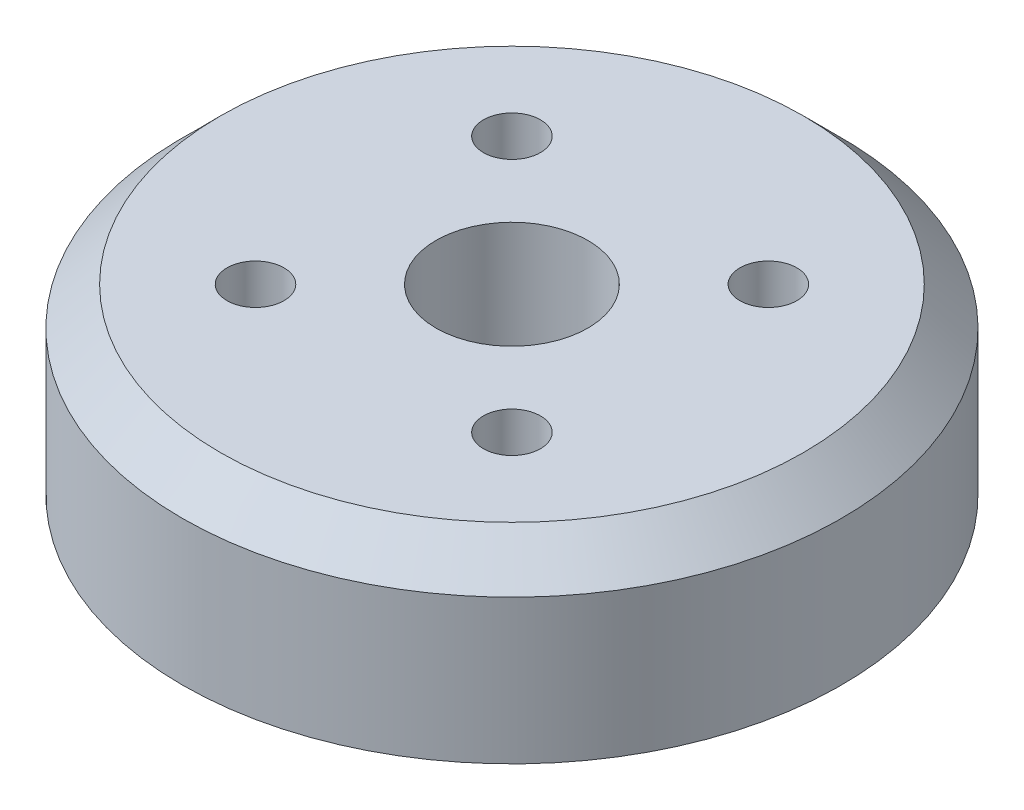
ISO-10303-21;
HEADER;
FILE_DESCRIPTION(('STEP AP214'),'2;1');
FILE_NAME('part.step','',(''),(''),'','','');
FILE_SCHEMA(('AUTOMOTIVE_DESIGN { 1 0 10303 214 1 1 1 1 }'));
ENDSEC;
DATA;
#1=APPLICATION_CONTEXT('core data for automotive mechanical design processes');
#2=APPLICATION_PROTOCOL_DEFINITION('international standard','automotive_design',2000,#1);
#3=PRODUCT_CONTEXT('',#1,'mechanical');
#4=PRODUCT('Part','Part','',(#3));
#5=PRODUCT_RELATED_PRODUCT_CATEGORY('part','',(#4));
#6=PRODUCT_DEFINITION_FORMATION('','',#4);
#7=PRODUCT_DEFINITION_CONTEXT('part definition',#1,'design');
#8=PRODUCT_DEFINITION('design','',#6,#7);
#9=PRODUCT_DEFINITION_SHAPE('','',#8);
#10=(LENGTH_UNIT() NAMED_UNIT(*) SI_UNIT(.MILLI.,.METRE.));
#11=(NAMED_UNIT(*) PLANE_ANGLE_UNIT() SI_UNIT($,.RADIAN.));
#12=(NAMED_UNIT(*) SI_UNIT($,.STERADIAN.) SOLID_ANGLE_UNIT());
#13=UNCERTAINTY_MEASURE_WITH_UNIT(LENGTH_MEASURE(1.E-05),#10,'distance_accuracy_value','');
#14=(GEOMETRIC_REPRESENTATION_CONTEXT(3) GLOBAL_UNCERTAINTY_ASSIGNED_CONTEXT((#13)) GLOBAL_UNIT_ASSIGNED_CONTEXT((#10,
#11,#12)) REPRESENTATION_CONTEXT('',''));
#15=CARTESIAN_POINT('',(0.,0.,0.));
#16=DIRECTION('',(0.,0.,1.));
#17=DIRECTION('',(1.,0.,0.));
#18=AXIS2_PLACEMENT_3D('',#15,#16,#17);
#19=CARTESIAN_POINT('',(0.,9.6,0.));
#20=DIRECTION('',(0.,-1.,0.));
#21=DIRECTION('',(0.,0.,-1.));
#22=AXIS2_PLACEMENT_3D('',#19,#20,#21);
#23=CYLINDRICAL_SURFACE('',#22,17.35);
#24=CARTESIAN_POINT('',(0.,7.6,0.));
#25=DIRECTION('',(0.,1.,0.));
#26=DIRECTION('',(0.,0.,1.));
#27=AXIS2_PLACEMENT_3D('',#24,#25,#26);
#28=CIRCLE('',#27,17.35);
#29=CARTESIAN_POINT('',(0.,7.6,17.35));
#30=VERTEX_POINT('',#29);
#31=EDGE_CURVE('E10',#30,#30,#28,.F.);
#32=ORIENTED_EDGE('',*,*,#31,.T.);
#33=EDGE_LOOP('',(#32));
#34=FACE_BOUND('',#33,.T.);
#35=CARTESIAN_POINT('',(0.,0.,0.));
#36=DIRECTION('',(0.,1.,0.));
#37=DIRECTION('',(0.,0.,1.));
#38=AXIS2_PLACEMENT_3D('',#35,#36,#37);
#39=CIRCLE('',#38,17.35);
#40=CARTESIAN_POINT('',(0.,0.,17.35));
#41=VERTEX_POINT('',#40);
#42=EDGE_CURVE('E48',#41,#41,#39,.T.);
#43=ORIENTED_EDGE('',*,*,#42,.T.);
#44=EDGE_LOOP('',(#43));
#45=FACE_BOUND('',#44,.T.);
#46=ADVANCED_FACE('F36',(#34,#45),#23,.T.);
#47=CARTESIAN_POINT('',(0.,9.6,0.));
#48=DIRECTION('',(0.,1.,0.));
#49=DIRECTION('',(0.,0.,1.));
#50=AXIS2_PLACEMENT_3D('',#47,#48,#49);
#51=PLANE('',#50);
#52=CARTESIAN_POINT('',(0.,9.6,0.));
#53=DIRECTION('',(0.,1.,0.));
#54=DIRECTION('',(0.,0.,1.));
#55=AXIS2_PLACEMENT_3D('',#52,#53,#54);
#56=CIRCLE('',#55,4.);
#57=CARTESIAN_POINT('',(0.,9.6,4.));
#58=VERTEX_POINT('',#57);
#59=EDGE_CURVE('E64',#58,#58,#56,.T.);
#60=ORIENTED_EDGE('',*,*,#59,.F.);
#61=EDGE_LOOP('',(#60));
#62=FACE_BOUND('',#61,.T.);
#63=CARTESIAN_POINT('',(-6.74999999999981,9.6,6.75));
#64=DIRECTION('',(0.,1.,0.));
#65=DIRECTION('',(0.,0.,1.));
#66=AXIS2_PLACEMENT_3D('',#63,#64,#65);
#67=CIRCLE('',#66,1.50000000000015);
#68=CARTESIAN_POINT('',(-6.74999999999981,9.6,8.25000000000015));
#69=VERTEX_POINT('',#68);
#70=EDGE_CURVE('E70',#69,#69,#67,.T.);
#71=ORIENTED_EDGE('',*,*,#70,.F.);
#72=EDGE_LOOP('',(#71));
#73=FACE_BOUND('',#72,.T.);
#74=CARTESIAN_POINT('',(6.75000000000019,9.6,6.74999999999981));
#75=DIRECTION('',(0.,1.,0.));
#76=DIRECTION('',(0.,0.,1.));
#77=AXIS2_PLACEMENT_3D('',#74,#75,#76);
#78=CIRCLE('',#77,1.5000000000003);
#79=CARTESIAN_POINT('',(6.75000000000019,9.6,8.25000000000011));
#80=VERTEX_POINT('',#79);
#81=EDGE_CURVE('E76',#80,#80,#78,.T.);
#82=ORIENTED_EDGE('',*,*,#81,.F.);
#83=EDGE_LOOP('',(#82));
#84=FACE_BOUND('',#83,.T.);
#85=CARTESIAN_POINT('',(6.75,9.6,-6.75000000000019));
#86=DIRECTION('',(0.,1.,0.));
#87=DIRECTION('',(0.,0.,1.));
#88=AXIS2_PLACEMENT_3D('',#85,#86,#87);
#89=CIRCLE('',#88,1.50000000000021);
#90=CARTESIAN_POINT('',(6.75,9.6,-5.24999999999998));
#91=VERTEX_POINT('',#90);
#92=EDGE_CURVE('E58',#91,#91,#89,.T.);
#93=ORIENTED_EDGE('',*,*,#92,.F.);
#94=EDGE_LOOP('',(#93));
#95=FACE_BOUND('',#94,.T.);
#96=CARTESIAN_POINT('',(-6.75,9.6,-6.75));
#97=DIRECTION('',(0.,1.,0.));
#98=DIRECTION('',(0.,0.,1.));
#99=AXIS2_PLACEMENT_3D('',#96,#97,#98);
#100=CIRCLE('',#99,1.5);
#101=CARTESIAN_POINT('',(-6.75,9.6,-5.25));
#102=VERTEX_POINT('',#101);
#103=EDGE_CURVE('E55',#102,#102,#100,.T.);
#104=ORIENTED_EDGE('',*,*,#103,.F.);
#105=EDGE_LOOP('',(#104));
#106=FACE_BOUND('',#105,.T.);
#107=CARTESIAN_POINT('',(0.,9.6,0.));
#108=DIRECTION('',(0.,1.,0.));
#109=DIRECTION('',(0.,0.,1.));
#110=AXIS2_PLACEMENT_3D('',#107,#108,#109);
#111=CIRCLE('',#110,15.35);
#112=CARTESIAN_POINT('',(0.,9.6,15.35));
#113=VERTEX_POINT('',#112);
#114=EDGE_CURVE('E44',#113,#113,#111,.T.);
#115=ORIENTED_EDGE('',*,*,#114,.T.);
#116=EDGE_LOOP('',(#115));
#117=FACE_BOUND('',#116,.T.);
#118=ADVANCED_FACE('F87',(#62,#73,#84,#95,#106,#117),#51,.T.);
#119=CARTESIAN_POINT('',(0.,0.,0.));
#120=DIRECTION('',(0.,1.,0.));
#121=DIRECTION('',(0.,0.,1.));
#122=AXIS2_PLACEMENT_3D('',#119,#120,#121);
#123=PLANE('',#122);
#124=CARTESIAN_POINT('',(0.,0.,0.));
#125=DIRECTION('',(0.,1.,0.));
#126=DIRECTION('',(0.,0.,1.));
#127=AXIS2_PLACEMENT_3D('',#124,#125,#126);
#128=CIRCLE('',#127,4.);
#129=CARTESIAN_POINT('',(0.,0.,4.));
#130=VERTEX_POINT('',#129);
#131=EDGE_CURVE('E61',#130,#130,#128,.T.);
#132=ORIENTED_EDGE('',*,*,#131,.T.);
#133=EDGE_LOOP('',(#132));
#134=FACE_BOUND('',#133,.T.);
#135=CARTESIAN_POINT('',(-6.74999999999981,0.,6.75));
#136=DIRECTION('',(0.,1.,0.));
#137=DIRECTION('',(0.,0.,1.));
#138=AXIS2_PLACEMENT_3D('',#135,#136,#137);
#139=CIRCLE('',#138,1.50000000000015);
#140=CARTESIAN_POINT('',(-6.74999999999981,0.,8.25000000000015));
#141=VERTEX_POINT('',#140);
#142=EDGE_CURVE('E67',#141,#141,#139,.T.);
#143=ORIENTED_EDGE('',*,*,#142,.T.);
#144=EDGE_LOOP('',(#143));
#145=FACE_BOUND('',#144,.T.);
#146=CARTESIAN_POINT('',(6.75000000000019,0.,6.74999999999981));
#147=DIRECTION('',(0.,1.,0.));
#148=DIRECTION('',(0.,0.,1.));
#149=AXIS2_PLACEMENT_3D('',#146,#147,#148);
#150=CIRCLE('',#149,1.5000000000003);
#151=CARTESIAN_POINT('',(6.75000000000019,0.,8.25000000000011));
#152=VERTEX_POINT('',#151);
#153=EDGE_CURVE('E73',#152,#152,#150,.T.);
#154=ORIENTED_EDGE('',*,*,#153,.T.);
#155=EDGE_LOOP('',(#154));
#156=FACE_BOUND('',#155,.T.);
#157=CARTESIAN_POINT('',(6.75,0.,-6.75000000000019));
#158=DIRECTION('',(0.,1.,0.));
#159=DIRECTION('',(0.,0.,1.));
#160=AXIS2_PLACEMENT_3D('',#157,#158,#159);
#161=CIRCLE('',#160,1.50000000000021);
#162=CARTESIAN_POINT('',(6.75,0.,-5.24999999999998));
#163=VERTEX_POINT('',#162);
#164=EDGE_CURVE('E79',#163,#163,#161,.T.);
#165=ORIENTED_EDGE('',*,*,#164,.T.);
#166=EDGE_LOOP('',(#165));
#167=FACE_BOUND('',#166,.T.);
#168=CARTESIAN_POINT('',(-6.75,0.,-6.75));
#169=DIRECTION('',(0.,1.,0.));
#170=DIRECTION('',(0.,0.,1.));
#171=AXIS2_PLACEMENT_3D('',#168,#169,#170);
#172=CIRCLE('',#171,1.5);
#173=CARTESIAN_POINT('',(-6.75,0.,-5.25));
#174=VERTEX_POINT('',#173);
#175=EDGE_CURVE('E52',#174,#174,#172,.T.);
#176=ORIENTED_EDGE('',*,*,#175,.T.);
#177=EDGE_LOOP('',(#176));
#178=FACE_BOUND('',#177,.T.);
#179=ORIENTED_EDGE('',*,*,#42,.F.);
#180=EDGE_LOOP('',(#179));
#181=FACE_BOUND('',#180,.T.);
#182=ADVANCED_FACE('F90',(#134,#145,#156,#167,#178,#181),#123,.F.);
#183=CARTESIAN_POINT('',(0.,9.6,0.));
#184=DIRECTION('',(0.,-1.,0.));
#185=DIRECTION('',(0.,0.,-1.));
#186=AXIS2_PLACEMENT_3D('',#183,#184,#185);
#187=CONICAL_SURFACE('',#186,15.35,0.785398163397446);
#188=ORIENTED_EDGE('',*,*,#31,.F.);
#189=EDGE_LOOP('',(#188));
#190=FACE_BOUND('',#189,.T.);
#191=ORIENTED_EDGE('',*,*,#114,.F.);
#192=EDGE_LOOP('',(#191));
#193=FACE_BOUND('',#192,.T.);
#194=ADVANCED_FACE('F39',(#190,#193),#187,.T.);
#195=CARTESIAN_POINT('',(-6.75,0.,-6.75));
#196=DIRECTION('',(0.,1.,0.));
#197=DIRECTION('',(0.,0.,1.));
#198=AXIS2_PLACEMENT_3D('',#195,#196,#197);
#199=CYLINDRICAL_SURFACE('',#198,1.5);
#200=ORIENTED_EDGE('',*,*,#175,.F.);
#201=EDGE_LOOP('',(#200));
#202=FACE_BOUND('',#201,.T.);
#203=ORIENTED_EDGE('',*,*,#103,.T.);
#204=EDGE_LOOP('',(#203));
#205=FACE_BOUND('',#204,.T.);
#206=ADVANCED_FACE('F95',(#202,#205),#199,.F.);
#207=CARTESIAN_POINT('',(6.75,0.,-6.75000000000019));
#208=DIRECTION('',(0.,1.,0.));
#209=DIRECTION('',(0.,0.,1.));
#210=AXIS2_PLACEMENT_3D('',#207,#208,#209);
#211=CYLINDRICAL_SURFACE('',#210,1.50000000000021);
#212=ORIENTED_EDGE('',*,*,#164,.F.);
#213=EDGE_LOOP('',(#212));
#214=FACE_BOUND('',#213,.T.);
#215=ORIENTED_EDGE('',*,*,#92,.T.);
#216=EDGE_LOOP('',(#215));
#217=FACE_BOUND('',#216,.T.);
#218=ADVANCED_FACE('F85',(#214,#217),#211,.F.);
#219=CARTESIAN_POINT('',(6.75000000000019,0.,6.74999999999981));
#220=DIRECTION('',(0.,1.,0.));
#221=DIRECTION('',(0.,0.,1.));
#222=AXIS2_PLACEMENT_3D('',#219,#220,#221);
#223=CYLINDRICAL_SURFACE('',#222,1.5000000000003);
#224=ORIENTED_EDGE('',*,*,#153,.F.);
#225=EDGE_LOOP('',(#224));
#226=FACE_BOUND('',#225,.T.);
#227=ORIENTED_EDGE('',*,*,#81,.T.);
#228=EDGE_LOOP('',(#227));
#229=FACE_BOUND('',#228,.T.);
#230=ADVANCED_FACE('F103',(#226,#229),#223,.F.);
#231=CARTESIAN_POINT('',(-6.74999999999981,0.,6.75));
#232=DIRECTION('',(0.,1.,0.));
#233=DIRECTION('',(0.,0.,1.));
#234=AXIS2_PLACEMENT_3D('',#231,#232,#233);
#235=CYLINDRICAL_SURFACE('',#234,1.50000000000015);
#236=ORIENTED_EDGE('',*,*,#142,.F.);
#237=EDGE_LOOP('',(#236));
#238=FACE_BOUND('',#237,.T.);
#239=ORIENTED_EDGE('',*,*,#70,.T.);
#240=EDGE_LOOP('',(#239));
#241=FACE_BOUND('',#240,.T.);
#242=ADVANCED_FACE('F131',(#238,#241),#235,.F.);
#243=CARTESIAN_POINT('',(0.,0.,0.));
#244=DIRECTION('',(0.,1.,0.));
#245=DIRECTION('',(0.,0.,1.));
#246=AXIS2_PLACEMENT_3D('',#243,#244,#245);
#247=CYLINDRICAL_SURFACE('',#246,4.);
#248=ORIENTED_EDGE('',*,*,#131,.F.);
#249=EDGE_LOOP('',(#248));
#250=FACE_BOUND('',#249,.T.);
#251=ORIENTED_EDGE('',*,*,#59,.T.);
#252=EDGE_LOOP('',(#251));
#253=FACE_BOUND('',#252,.T.);
#254=ADVANCED_FACE('F138',(#250,#253),#247,.F.);
#255=CLOSED_SHELL('',(#46,#118,#182,#194,#206,#218,#230,#242,#254));
#256=MANIFOLD_SOLID_BREP('B2',#255);
#257=ADVANCED_BREP_SHAPE_REPRESENTATION('',(#18,#256),#14);
#258=SHAPE_DEFINITION_REPRESENTATION(#9,#257);
ENDSEC;
END-ISO-10303-21;
